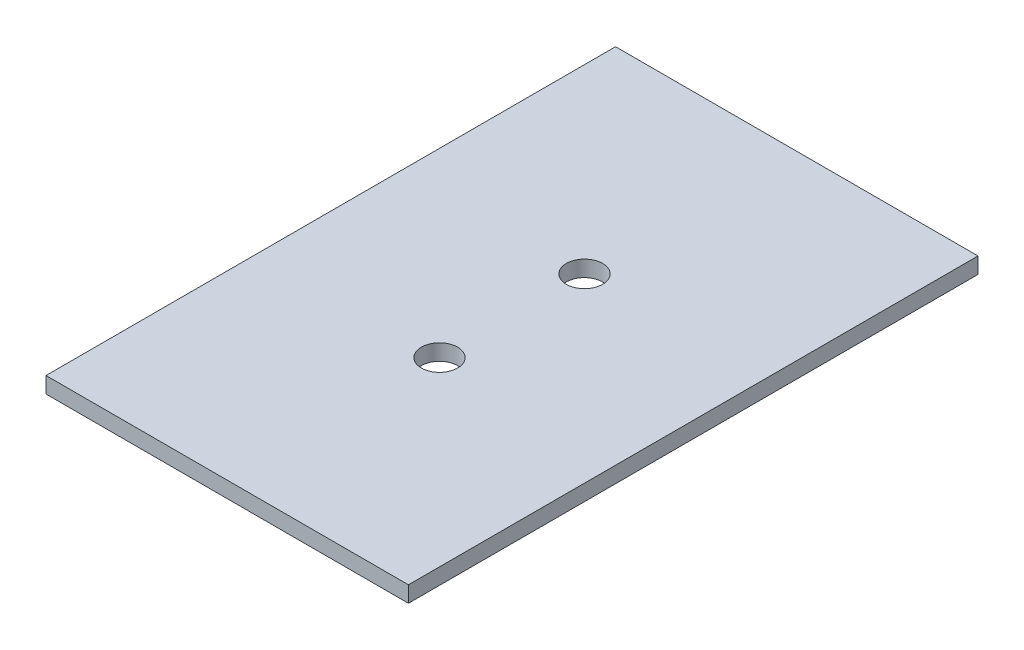
ISO-10303-21;
HEADER;
FILE_DESCRIPTION(('STEP AP214'),'2;1');
FILE_NAME('part.step','',(''),(''),'','','');
FILE_SCHEMA(('AUTOMOTIVE_DESIGN { 1 0 10303 214 1 1 1 1 }'));
ENDSEC;
DATA;
#1=APPLICATION_CONTEXT('core data for automotive mechanical design processes');
#2=APPLICATION_PROTOCOL_DEFINITION('international standard','automotive_design',2000,#1);
#3=PRODUCT_CONTEXT('',#1,'mechanical');
#4=PRODUCT('Part','Part','',(#3));
#5=PRODUCT_RELATED_PRODUCT_CATEGORY('part','',(#4));
#6=PRODUCT_DEFINITION_FORMATION('','',#4);
#7=PRODUCT_DEFINITION_CONTEXT('part definition',#1,'design');
#8=PRODUCT_DEFINITION('design','',#6,#7);
#9=PRODUCT_DEFINITION_SHAPE('','',#8);
#10=(LENGTH_UNIT() NAMED_UNIT(*) SI_UNIT(.MILLI.,.METRE.));
#11=(NAMED_UNIT(*) PLANE_ANGLE_UNIT() SI_UNIT($,.RADIAN.));
#12=(NAMED_UNIT(*) SI_UNIT($,.STERADIAN.) SOLID_ANGLE_UNIT());
#13=UNCERTAINTY_MEASURE_WITH_UNIT(LENGTH_MEASURE(1.E-05),#10,'distance_accuracy_value','');
#14=(GEOMETRIC_REPRESENTATION_CONTEXT(3) GLOBAL_UNCERTAINTY_ASSIGNED_CONTEXT((#13)) GLOBAL_UNIT_ASSIGNED_CONTEXT((#10,
#11,#12)) REPRESENTATION_CONTEXT('',''));
#15=CARTESIAN_POINT('',(0.,0.,0.));
#16=DIRECTION('',(0.,0.,1.));
#17=DIRECTION('',(1.,0.,0.));
#18=AXIS2_PLACEMENT_3D('',#15,#16,#17);
#19=CARTESIAN_POINT('',(-17.5,0.775,-27.5));
#20=DIRECTION('',(1.,0.,0.));
#21=DIRECTION('',(0.,0.,-1.));
#22=AXIS2_PLACEMENT_3D('',#19,#20,#21);
#23=PLANE('',#22);
#24=DIRECTION('',(0.,0.,1.));
#25=VECTOR('',#24,1.);
#26=CARTESIAN_POINT('',(-17.5,-0.775,-27.5));
#27=LINE('',#26,#25);
#28=CARTESIAN_POINT('',(-17.5,-0.775,-27.5));
#29=VERTEX_POINT('',#28);
#30=CARTESIAN_POINT('',(-17.5,-0.775,27.5));
#31=VERTEX_POINT('',#30);
#32=EDGE_CURVE('E100',#29,#31,#27,.T.);
#33=ORIENTED_EDGE('',*,*,#32,.T.);
#34=DIRECTION('',(0.,-1.,0.));
#35=VECTOR('',#34,1.);
#36=CARTESIAN_POINT('',(-17.5,0.775,27.5));
#37=LINE('',#36,#35);
#38=CARTESIAN_POINT('',(-17.5,0.775,27.5));
#39=VERTEX_POINT('',#38);
#40=EDGE_CURVE('E11',#39,#31,#37,.T.);
#41=ORIENTED_EDGE('',*,*,#40,.F.);
#42=DIRECTION('',(0.,0.,1.));
#43=VECTOR('',#42,1.);
#44=CARTESIAN_POINT('',(-17.5,0.775,-27.5));
#45=LINE('',#44,#43);
#46=CARTESIAN_POINT('',(-17.5,0.775,-27.5));
#47=VERTEX_POINT('',#46);
#48=EDGE_CURVE('E87',#47,#39,#45,.T.);
#49=ORIENTED_EDGE('',*,*,#48,.F.);
#50=DIRECTION('',(0.,-1.,0.));
#51=VECTOR('',#50,1.);
#52=CARTESIAN_POINT('',(-17.5,0.775,-27.5));
#53=LINE('',#52,#51);
#54=EDGE_CURVE('E96',#47,#29,#53,.T.);
#55=ORIENTED_EDGE('',*,*,#54,.T.);
#56=EDGE_LOOP('',(#33,#41,#49,#55));
#57=FACE_BOUND('',#56,.T.);
#58=ADVANCED_FACE('F34',(#57),#23,.F.);
#59=CARTESIAN_POINT('',(-17.5,0.775,27.5));
#60=DIRECTION('',(0.,0.,-1.));
#61=DIRECTION('',(-1.,0.,0.));
#62=AXIS2_PLACEMENT_3D('',#59,#60,#61);
#63=PLANE('',#62);
#64=DIRECTION('',(1.,0.,0.));
#65=VECTOR('',#64,1.);
#66=CARTESIAN_POINT('',(-17.5,-0.775,27.5));
#67=LINE('',#66,#65);
#68=CARTESIAN_POINT('',(17.5,-0.775,27.5));
#69=VERTEX_POINT('',#68);
#70=EDGE_CURVE('E91',#31,#69,#67,.T.);
#71=ORIENTED_EDGE('',*,*,#70,.T.);
#72=DIRECTION('',(0.,-1.,0.));
#73=VECTOR('',#72,1.);
#74=CARTESIAN_POINT('',(17.5,0.775,27.5));
#75=LINE('',#74,#73);
#76=CARTESIAN_POINT('',(17.5,0.775,27.5));
#77=VERTEX_POINT('',#76);
#78=EDGE_CURVE('E43',#77,#69,#75,.T.);
#79=ORIENTED_EDGE('',*,*,#78,.F.);
#80=DIRECTION('',(1.,0.,0.));
#81=VECTOR('',#80,1.);
#82=CARTESIAN_POINT('',(-17.5,0.775,27.5));
#83=LINE('',#82,#81);
#84=EDGE_CURVE('E82',#39,#77,#83,.T.);
#85=ORIENTED_EDGE('',*,*,#84,.F.);
#86=ORIENTED_EDGE('',*,*,#40,.T.);
#87=EDGE_LOOP('',(#71,#79,#85,#86));
#88=FACE_BOUND('',#87,.T.);
#89=ADVANCED_FACE('F90',(#88),#63,.F.);
#90=CARTESIAN_POINT('',(17.5,0.775,-27.5));
#91=DIRECTION('',(-1.,0.,0.));
#92=DIRECTION('',(0.,0.,1.));
#93=AXIS2_PLACEMENT_3D('',#90,#91,#92);
#94=PLANE('',#93);
#95=DIRECTION('',(0.,0.,-1.));
#96=VECTOR('',#95,1.);
#97=CARTESIAN_POINT('',(17.5,-0.775,-27.5));
#98=LINE('',#97,#96);
#99=CARTESIAN_POINT('',(17.5,-0.775,-27.5));
#100=VERTEX_POINT('',#99);
#101=EDGE_CURVE('E69',#69,#100,#98,.T.);
#102=ORIENTED_EDGE('',*,*,#101,.T.);
#103=DIRECTION('',(0.,-1.,0.));
#104=VECTOR('',#103,1.);
#105=CARTESIAN_POINT('',(17.5,0.775,-27.5));
#106=LINE('',#105,#104);
#107=CARTESIAN_POINT('',(17.5,0.775,-27.5));
#108=VERTEX_POINT('',#107);
#109=EDGE_CURVE('E92',#108,#100,#106,.T.);
#110=ORIENTED_EDGE('',*,*,#109,.F.);
#111=DIRECTION('',(0.,0.,-1.));
#112=VECTOR('',#111,1.);
#113=CARTESIAN_POINT('',(17.5,0.775,-27.5));
#114=LINE('',#113,#112);
#115=EDGE_CURVE('E85',#77,#108,#114,.T.);
#116=ORIENTED_EDGE('',*,*,#115,.F.);
#117=ORIENTED_EDGE('',*,*,#78,.T.);
#118=EDGE_LOOP('',(#102,#110,#116,#117));
#119=FACE_BOUND('',#118,.T.);
#120=ADVANCED_FACE('F94',(#119),#94,.F.);
#121=CARTESIAN_POINT('',(-17.5,0.775,-27.5));
#122=DIRECTION('',(0.,0.,1.));
#123=DIRECTION('',(1.,0.,0.));
#124=AXIS2_PLACEMENT_3D('',#121,#122,#123);
#125=PLANE('',#124);
#126=DIRECTION('',(-1.,0.,0.));
#127=VECTOR('',#126,1.);
#128=CARTESIAN_POINT('',(-17.5,-0.775,-27.5));
#129=LINE('',#128,#127);
#130=EDGE_CURVE('E75',#100,#29,#129,.T.);
#131=ORIENTED_EDGE('',*,*,#130,.T.);
#132=ORIENTED_EDGE('',*,*,#54,.F.);
#133=DIRECTION('',(-1.,0.,0.));
#134=VECTOR('',#133,1.);
#135=CARTESIAN_POINT('',(-17.5,0.775,-27.5));
#136=LINE('',#135,#134);
#137=EDGE_CURVE('E52',#108,#47,#136,.T.);
#138=ORIENTED_EDGE('',*,*,#137,.F.);
#139=ORIENTED_EDGE('',*,*,#109,.T.);
#140=EDGE_LOOP('',(#131,#132,#138,#139));
#141=FACE_BOUND('',#140,.T.);
#142=ADVANCED_FACE('F145',(#141),#125,.F.);
#143=CARTESIAN_POINT('',(0.,0.775,0.));
#144=DIRECTION('',(0.,1.,0.));
#145=DIRECTION('',(0.,0.,1.));
#146=AXIS2_PLACEMENT_3D('',#143,#144,#145);
#147=PLANE('',#146);
#148=CARTESIAN_POINT('',(0.,0.775,7.));
#149=DIRECTION('',(0.,1.,0.));
#150=DIRECTION('',(0.,0.,1.));
#151=AXIS2_PLACEMENT_3D('',#148,#149,#150);
#152=CIRCLE('',#151,1.75);
#153=CARTESIAN_POINT('',(0.,0.775,8.75));
#154=VERTEX_POINT('',#153);
#155=EDGE_CURVE('E110',#154,#154,#152,.T.);
#156=ORIENTED_EDGE('',*,*,#155,.F.);
#157=EDGE_LOOP('',(#156));
#158=FACE_BOUND('',#157,.T.);
#159=CARTESIAN_POINT('',(0.,0.775,-7.));
#160=DIRECTION('',(0.,1.,0.));
#161=DIRECTION('',(0.,0.,1.));
#162=AXIS2_PLACEMENT_3D('',#159,#160,#161);
#163=CIRCLE('',#162,1.75);
#164=CARTESIAN_POINT('',(0.,0.775,-5.25));
#165=VERTEX_POINT('',#164);
#166=EDGE_CURVE('E103',#165,#165,#163,.T.);
#167=ORIENTED_EDGE('',*,*,#166,.F.);
#168=EDGE_LOOP('',(#167));
#169=FACE_BOUND('',#168,.T.);
#170=ORIENTED_EDGE('',*,*,#48,.T.);
#171=ORIENTED_EDGE('',*,*,#84,.T.);
#172=ORIENTED_EDGE('',*,*,#115,.T.);
#173=ORIENTED_EDGE('',*,*,#137,.T.);
#174=EDGE_LOOP('',(#170,#171,#172,#173));
#175=FACE_BOUND('',#174,.T.);
#176=ADVANCED_FACE('F83',(#158,#169,#175),#147,.T.);
#177=CARTESIAN_POINT('',(0.,-0.775,0.));
#178=DIRECTION('',(0.,1.,0.));
#179=DIRECTION('',(0.,0.,1.));
#180=AXIS2_PLACEMENT_3D('',#177,#178,#179);
#181=PLANE('',#180);
#182=CARTESIAN_POINT('',(0.,-0.775,7.));
#183=DIRECTION('',(0.,1.,0.));
#184=DIRECTION('',(0.,0.,1.));
#185=AXIS2_PLACEMENT_3D('',#182,#183,#184);
#186=CIRCLE('',#185,1.75);
#187=CARTESIAN_POINT('',(0.,-0.775,8.75));
#188=VERTEX_POINT('',#187);
#189=EDGE_CURVE('E37',#188,#188,#186,.T.);
#190=ORIENTED_EDGE('',*,*,#189,.T.);
#191=EDGE_LOOP('',(#190));
#192=FACE_BOUND('',#191,.T.);
#193=CARTESIAN_POINT('',(0.,-0.775,-7.));
#194=DIRECTION('',(0.,1.,0.));
#195=DIRECTION('',(0.,0.,1.));
#196=AXIS2_PLACEMENT_3D('',#193,#194,#195);
#197=CIRCLE('',#196,1.75);
#198=CARTESIAN_POINT('',(0.,-0.775,-5.25));
#199=VERTEX_POINT('',#198);
#200=EDGE_CURVE('E108',#199,#199,#197,.T.);
#201=ORIENTED_EDGE('',*,*,#200,.T.);
#202=EDGE_LOOP('',(#201));
#203=FACE_BOUND('',#202,.T.);
#204=ORIENTED_EDGE('',*,*,#32,.F.);
#205=ORIENTED_EDGE('',*,*,#130,.F.);
#206=ORIENTED_EDGE('',*,*,#101,.F.);
#207=ORIENTED_EDGE('',*,*,#70,.F.);
#208=EDGE_LOOP('',(#204,#205,#206,#207));
#209=FACE_BOUND('',#208,.T.);
#210=ADVANCED_FACE('F122',(#192,#203,#209),#181,.F.);
#211=CARTESIAN_POINT('',(0.,-5.,-7.));
#212=DIRECTION('',(0.,1.,0.));
#213=DIRECTION('',(0.,0.,1.));
#214=AXIS2_PLACEMENT_3D('',#211,#212,#213);
#215=CYLINDRICAL_SURFACE('',#214,1.75);
#216=ORIENTED_EDGE('',*,*,#166,.T.);
#217=EDGE_LOOP('',(#216));
#218=FACE_BOUND('',#217,.T.);
#219=ORIENTED_EDGE('',*,*,#200,.F.);
#220=EDGE_LOOP('',(#219));
#221=FACE_BOUND('',#220,.T.);
#222=ADVANCED_FACE('F126',(#218,#221),#215,.F.);
#223=CARTESIAN_POINT('',(0.,-5.,7.));
#224=DIRECTION('',(0.,1.,0.));
#225=DIRECTION('',(0.,0.,1.));
#226=AXIS2_PLACEMENT_3D('',#223,#224,#225);
#227=CYLINDRICAL_SURFACE('',#226,1.75);
#228=ORIENTED_EDGE('',*,*,#155,.T.);
#229=EDGE_LOOP('',(#228));
#230=FACE_BOUND('',#229,.T.);
#231=ORIENTED_EDGE('',*,*,#189,.F.);
#232=EDGE_LOOP('',(#231));
#233=FACE_BOUND('',#232,.T.);
#234=ADVANCED_FACE('F124',(#230,#233),#227,.F.);
#235=CLOSED_SHELL('',(#58,#89,#120,#142,#176,#210,#222,#234));
#236=MANIFOLD_SOLID_BREP('B2',#235);
#237=ADVANCED_BREP_SHAPE_REPRESENTATION('',(#18,#236),#14);
#238=SHAPE_DEFINITION_REPRESENTATION(#9,#237);
ENDSEC;
END-ISO-10303-21;
